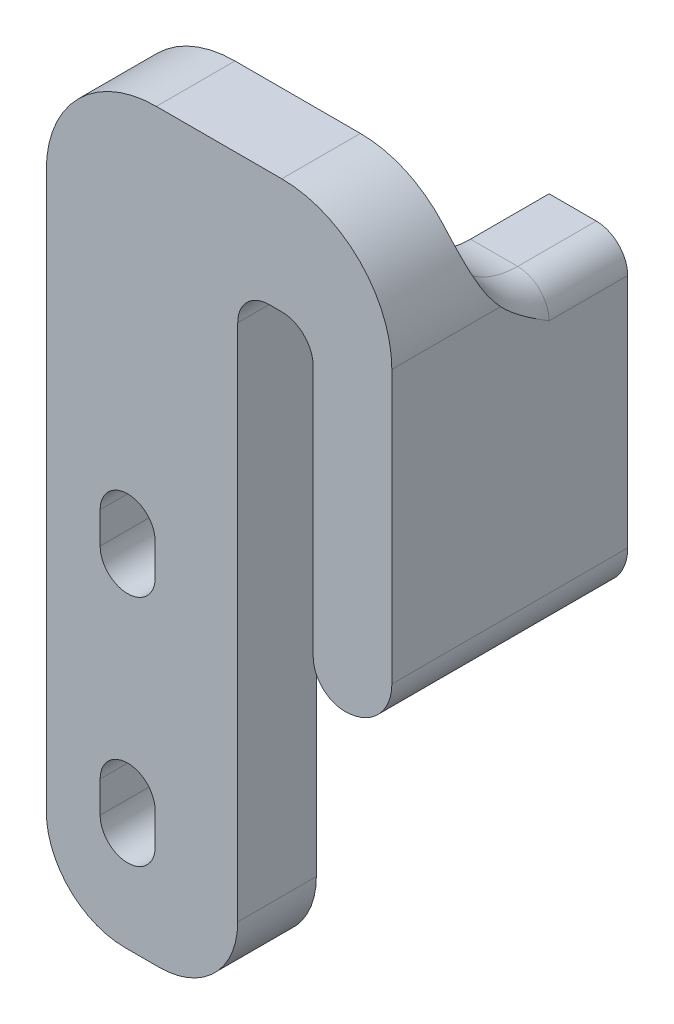
ISO-10303-21;
HEADER;
FILE_DESCRIPTION(('STEP AP214'),'2;1');
FILE_NAME('part.step','',(''),(''),'','','');
FILE_SCHEMA(('AUTOMOTIVE_DESIGN { 1 0 10303 214 1 1 1 1 }'));
ENDSEC;
DATA;
#1=APPLICATION_CONTEXT('core data for automotive mechanical design processes');
#2=APPLICATION_PROTOCOL_DEFINITION('international standard','automotive_design',2000,#1);
#3=PRODUCT_CONTEXT('',#1,'mechanical');
#4=PRODUCT('Part','Part','',(#3));
#5=PRODUCT_RELATED_PRODUCT_CATEGORY('part','',(#4));
#6=PRODUCT_DEFINITION_FORMATION('','',#4);
#7=PRODUCT_DEFINITION_CONTEXT('part definition',#1,'design');
#8=PRODUCT_DEFINITION('design','',#6,#7);
#9=PRODUCT_DEFINITION_SHAPE('','',#8);
#10=(LENGTH_UNIT() NAMED_UNIT(*) SI_UNIT(.MILLI.,.METRE.));
#11=(NAMED_UNIT(*) PLANE_ANGLE_UNIT() SI_UNIT($,.RADIAN.));
#12=(NAMED_UNIT(*) SI_UNIT($,.STERADIAN.) SOLID_ANGLE_UNIT());
#13=UNCERTAINTY_MEASURE_WITH_UNIT(LENGTH_MEASURE(1.E-05),#10,'distance_accuracy_value','');
#14=(GEOMETRIC_REPRESENTATION_CONTEXT(3) GLOBAL_UNCERTAINTY_ASSIGNED_CONTEXT((#13)) GLOBAL_UNIT_ASSIGNED_CONTEXT((#10,
#11,#12)) REPRESENTATION_CONTEXT('',''));
#15=CARTESIAN_POINT('',(0.,0.,0.));
#16=DIRECTION('',(0.,0.,1.));
#17=DIRECTION('',(1.,0.,0.));
#18=AXIS2_PLACEMENT_3D('',#15,#16,#17);
#19=CARTESIAN_POINT('',(0.,0.,0.));
#20=DIRECTION('',(0.,0.,-1.));
#21=DIRECTION('',(-1.,0.,0.));
#22=AXIS2_PLACEMENT_3D('',#19,#20,#21);
#23=PLANE('',#22);
#24=DIRECTION('',(0.,-1.,0.));
#25=VECTOR('',#24,1.);
#26=CARTESIAN_POINT('',(-3.66240887052868,1.5,0.));
#27=LINE('',#26,#25);
#28=CARTESIAN_POINT('',(-3.66240887052868,3.5,0.));
#29=VERTEX_POINT('',#28);
#30=CARTESIAN_POINT('',(-3.66240887052868,1.5,0.));
#31=VERTEX_POINT('',#30);
#32=EDGE_CURVE('E274',#29,#31,#27,.T.);
#33=ORIENTED_EDGE('',*,*,#32,.T.);
#34=CARTESIAN_POINT('',(-1.91240887052868,1.5,0.));
#35=DIRECTION('',(0.,0.,1.));
#36=DIRECTION('',(1.,0.,0.));
#37=AXIS2_PLACEMENT_3D('',#34,#35,#36);
#38=CIRCLE('',#37,1.75);
#39=CARTESIAN_POINT('',(-0.162408870528676,1.5,0.));
#40=VERTEX_POINT('',#39);
#41=EDGE_CURVE('E270',#31,#40,#38,.T.);
#42=ORIENTED_EDGE('',*,*,#41,.T.);
#43=DIRECTION('',(0.,1.,0.));
#44=VECTOR('',#43,1.);
#45=CARTESIAN_POINT('',(-0.162408870528676,1.5,0.));
#46=LINE('',#45,#44);
#47=CARTESIAN_POINT('',(-0.162408870528676,3.5,0.));
#48=VERTEX_POINT('',#47);
#49=EDGE_CURVE('E284',#40,#48,#46,.T.);
#50=ORIENTED_EDGE('',*,*,#49,.T.);
#51=CARTESIAN_POINT('',(-1.91240887052868,3.5,0.));
#52=DIRECTION('',(0.,0.,1.));
#53=DIRECTION('',(1.,0.,0.));
#54=AXIS2_PLACEMENT_3D('',#51,#52,#53);
#55=CIRCLE('',#54,1.75);
#56=EDGE_CURVE('E287',#48,#29,#55,.T.);
#57=ORIENTED_EDGE('',*,*,#56,.T.);
#58=EDGE_LOOP('',(#33,#42,#50,#57));
#59=FACE_BOUND('',#58,.T.);
#60=DIRECTION('',(0.,-1.,0.));
#61=VECTOR('',#60,1.);
#62=CARTESIAN_POINT('',(-3.66240887052868,-13.3256409288402,0.));
#63=LINE('',#62,#61);
#64=CARTESIAN_POINT('',(-3.66240887052868,-11.3256409288402,0.));
#65=VERTEX_POINT('',#64);
#66=CARTESIAN_POINT('',(-3.66240887052868,-13.3256409288402,0.));
#67=VERTEX_POINT('',#66);
#68=EDGE_CURVE('E243',#65,#67,#63,.T.);
#69=ORIENTED_EDGE('',*,*,#68,.T.);
#70=CARTESIAN_POINT('',(-1.91240887052868,-13.3256409288402,0.));
#71=DIRECTION('',(0.,0.,1.));
#72=DIRECTION('',(1.,0.,0.));
#73=AXIS2_PLACEMENT_3D('',#70,#71,#72);
#74=CIRCLE('',#73,1.75);
#75=CARTESIAN_POINT('',(-0.162408870528676,-13.3256409288402,0.));
#76=VERTEX_POINT('',#75);
#77=EDGE_CURVE('E232',#67,#76,#74,.T.);
#78=ORIENTED_EDGE('',*,*,#77,.T.);
#79=DIRECTION('',(0.,1.,0.));
#80=VECTOR('',#79,1.);
#81=CARTESIAN_POINT('',(-0.162408870528676,-13.3256409288402,0.));
#82=LINE('',#81,#80);
#83=CARTESIAN_POINT('',(-0.162408870528677,-11.3256409288402,0.));
#84=VERTEX_POINT('',#83);
#85=EDGE_CURVE('E253',#76,#84,#82,.T.);
#86=ORIENTED_EDGE('',*,*,#85,.T.);
#87=CARTESIAN_POINT('',(-1.91240887052868,-11.3256409288402,0.));
#88=DIRECTION('',(0.,0.,1.));
#89=DIRECTION('',(1.,0.,0.));
#90=AXIS2_PLACEMENT_3D('',#87,#88,#89);
#91=CIRCLE('',#90,1.75);
#92=EDGE_CURVE('E256',#84,#65,#91,.T.);
#93=ORIENTED_EDGE('',*,*,#92,.T.);
#94=EDGE_LOOP('',(#69,#78,#86,#93));
#95=FACE_BOUND('',#94,.T.);
#96=CARTESIAN_POINT('',(7.88759112947134,20.5,0.));
#97=DIRECTION('',(0.,0.,-1.));
#98=DIRECTION('',(-1.,0.,0.));
#99=AXIS2_PLACEMENT_3D('',#96,#97,#98);
#100=CIRCLE('',#99,7.);
#101=CARTESIAN_POINT('',(7.88759112947134,27.5,0.));
#102=VERTEX_POINT('',#101);
#103=CARTESIAN_POINT('',(13.1011127977164,25.1711017773903,0.));
#104=VERTEX_POINT('',#103);
#105=EDGE_CURVE('E344',#102,#104,#100,.T.);
#106=ORIENTED_EDGE('',*,*,#105,.T.);
#107=CARTESIAN_POINT('',(12.8875911294713,18.1743590711598,0.));
#108=DIRECTION('',(0.,0.,-1.));
#109=DIRECTION('',(-1.,0.,0.));
#110=AXIS2_PLACEMENT_3D('',#107,#108,#109);
#111=CIRCLE('',#110,7.);
#112=CARTESIAN_POINT('',(12.8875911294713,25.1743590711598,0.));
#113=VERTEX_POINT('',#112);
#114=EDGE_CURVE('E417',#104,#113,#111,.F.);
#115=ORIENTED_EDGE('',*,*,#114,.T.);
#116=DIRECTION('',(-1.,0.,0.));
#117=VECTOR('',#116,1.);
#118=CARTESIAN_POINT('',(9.88759112947133,25.1743590711598,0.));
#119=LINE('',#118,#117);
#120=CARTESIAN_POINT('',(9.88759112947133,25.1743590711598,0.));
#121=VERTEX_POINT('',#120);
#122=EDGE_CURVE('E411',#113,#121,#119,.T.);
#123=ORIENTED_EDGE('',*,*,#122,.T.);
#124=DIRECTION('',(0.,1.,0.));
#125=VECTOR('',#124,1.);
#126=CARTESIAN_POINT('',(9.88759112947134,0.174359071159812,0.));
#127=LINE('',#126,#125);
#128=CARTESIAN_POINT('',(9.88759112947133,18.1743590711598,0.));
#129=VERTEX_POINT('',#128);
#130=EDGE_CURVE('E386',#129,#121,#127,.T.);
#131=ORIENTED_EDGE('',*,*,#130,.F.);
#132=CARTESIAN_POINT('',(7.88759112947133,18.1743590711598,0.));
#133=DIRECTION('',(0.,0.,-1.));
#134=DIRECTION('',(-1.,0.,0.));
#135=AXIS2_PLACEMENT_3D('',#132,#133,#134);
#136=CIRCLE('',#135,2.);
#137=CARTESIAN_POINT('',(7.88759112947133,20.1743590711598,0.));
#138=VERTEX_POINT('',#137);
#139=EDGE_CURVE('E403',#129,#138,#136,.F.);
#140=ORIENTED_EDGE('',*,*,#139,.T.);
#141=DIRECTION('',(1.,0.,0.));
#142=VECTOR('',#141,1.);
#143=CARTESIAN_POINT('',(9.88759112947133,20.1743590711598,0.));
#144=LINE('',#143,#142);
#145=CARTESIAN_POINT('',(7.08759112947132,20.1743590711598,0.));
#146=VERTEX_POINT('',#145);
#147=EDGE_CURVE('E333',#146,#138,#144,.T.);
#148=ORIENTED_EDGE('',*,*,#147,.F.);
#149=CARTESIAN_POINT('',(7.08759112947132,18.1743590711598,0.));
#150=DIRECTION('',(0.,0.,-1.));
#151=DIRECTION('',(-1.,0.,0.));
#152=AXIS2_PLACEMENT_3D('',#149,#150,#151);
#153=CIRCLE('',#152,2.);
#154=CARTESIAN_POINT('',(5.08759112947132,18.1743590711598,0.));
#155=VERTEX_POINT('',#154);
#156=EDGE_CURVE('E407',#146,#155,#153,.F.);
#157=ORIENTED_EDGE('',*,*,#156,.T.);
#158=DIRECTION('',(0.,1.,0.));
#159=VECTOR('',#158,1.);
#160=CARTESIAN_POINT('',(5.08759112947132,-19.8256409288402,0.));
#161=LINE('',#160,#159);
#162=CARTESIAN_POINT('',(5.08759112947132,-14.8256409288402,0.));
#163=VERTEX_POINT('',#162);
#164=EDGE_CURVE('E330',#163,#155,#161,.T.);
#165=ORIENTED_EDGE('',*,*,#164,.F.);
#166=CARTESIAN_POINT('',(0.0875911294713214,-14.8256409288402,0.));
#167=DIRECTION('',(0.,0.,-1.));
#168=DIRECTION('',(-1.,0.,0.));
#169=AXIS2_PLACEMENT_3D('',#166,#167,#168);
#170=CIRCLE('',#169,5.);
#171=CARTESIAN_POINT('',(0.0875911294713197,-19.8256409288402,0.));
#172=VERTEX_POINT('',#171);
#173=EDGE_CURVE('E347',#163,#172,#170,.T.);
#174=ORIENTED_EDGE('',*,*,#173,.T.);
#175=DIRECTION('',(1.,0.,0.));
#176=VECTOR('',#175,1.);
#177=CARTESIAN_POINT('',(-7.08759112947132,-19.8256409288402,0.));
#178=LINE('',#177,#176);
#179=CARTESIAN_POINT('',(-2.08759112947132,-19.8256409288402,0.));
#180=VERTEX_POINT('',#179);
#181=EDGE_CURVE('E327',#180,#172,#178,.T.);
#182=ORIENTED_EDGE('',*,*,#181,.F.);
#183=CARTESIAN_POINT('',(-2.08759112947132,-14.8256409288402,0.));
#184=DIRECTION('',(0.,0.,-1.));
#185=DIRECTION('',(-1.,0.,0.));
#186=AXIS2_PLACEMENT_3D('',#183,#184,#185);
#187=CIRCLE('',#186,5.);
#188=CARTESIAN_POINT('',(-7.08759112947132,-14.8256409288402,0.));
#189=VERTEX_POINT('',#188);
#190=EDGE_CURVE('E349',#180,#189,#187,.T.);
#191=ORIENTED_EDGE('',*,*,#190,.T.);
#192=DIRECTION('',(0.,-1.,0.));
#193=VECTOR('',#192,1.);
#194=CARTESIAN_POINT('',(-7.08759112947132,-19.8256409288402,0.));
#195=LINE('',#194,#193);
#196=CARTESIAN_POINT('',(-7.08759112947132,20.5,0.));
#197=VERTEX_POINT('',#196);
#198=EDGE_CURVE('E301',#197,#189,#195,.T.);
#199=ORIENTED_EDGE('',*,*,#198,.F.);
#200=CARTESIAN_POINT('',(-0.0875911294713205,20.5,0.));
#201=DIRECTION('',(0.,0.,-1.));
#202=DIRECTION('',(-1.,0.,0.));
#203=AXIS2_PLACEMENT_3D('',#200,#201,#202);
#204=CIRCLE('',#203,7.);
#205=CARTESIAN_POINT('',(-0.0875911294713205,27.5,0.));
#206=VERTEX_POINT('',#205);
#207=EDGE_CURVE('E342',#197,#206,#204,.T.);
#208=ORIENTED_EDGE('',*,*,#207,.T.);
#209=DIRECTION('',(-1.,0.,0.));
#210=VECTOR('',#209,1.);
#211=CARTESIAN_POINT('',(4.91240887052868,27.5,0.));
#212=LINE('',#211,#210);
#213=EDGE_CURVE('E306',#102,#206,#212,.T.);
#214=ORIENTED_EDGE('',*,*,#213,.F.);
#215=EDGE_LOOP('',(#106,#115,#123,#131,#140,#148,#157,#165,#174,#182,#191,#199,#208,#214));
#216=FACE_BOUND('',#215,.T.);
#217=ADVANCED_FACE('F36',(#59,#95,#216),#23,.T.);
#218=CARTESIAN_POINT('',(0.,0.,5.));
#219=DIRECTION('',(0.,0.,-1.));
#220=DIRECTION('',(-1.,0.,0.));
#221=AXIS2_PLACEMENT_3D('',#218,#219,#220);
#222=PLANE('',#221);
#223=CARTESIAN_POINT('',(-1.91240887052868,1.5,5.));
#224=DIRECTION('',(0.,0.,1.));
#225=DIRECTION('',(1.,0.,0.));
#226=AXIS2_PLACEMENT_3D('',#223,#224,#225);
#227=CIRCLE('',#226,1.75);
#228=CARTESIAN_POINT('',(-3.66240887052868,1.5,5.));
#229=VERTEX_POINT('',#228);
#230=CARTESIAN_POINT('',(-0.162408870528676,1.5,5.));
#231=VERTEX_POINT('',#230);
#232=EDGE_CURVE('E271',#229,#231,#227,.T.);
#233=ORIENTED_EDGE('',*,*,#232,.F.);
#234=DIRECTION('',(0.,-1.,0.));
#235=VECTOR('',#234,1.);
#236=CARTESIAN_POINT('',(-3.66240887052868,1.5,5.));
#237=LINE('',#236,#235);
#238=CARTESIAN_POINT('',(-3.66240887052868,3.5,5.));
#239=VERTEX_POINT('',#238);
#240=EDGE_CURVE('E279',#239,#229,#237,.T.);
#241=ORIENTED_EDGE('',*,*,#240,.F.);
#242=CARTESIAN_POINT('',(-1.91240887052868,3.5,5.));
#243=DIRECTION('',(0.,0.,1.));
#244=DIRECTION('',(1.,0.,0.));
#245=AXIS2_PLACEMENT_3D('',#242,#243,#244);
#246=CIRCLE('',#245,1.75);
#247=CARTESIAN_POINT('',(-0.162408870528676,3.5,5.));
#248=VERTEX_POINT('',#247);
#249=EDGE_CURVE('E276',#248,#239,#246,.T.);
#250=ORIENTED_EDGE('',*,*,#249,.F.);
#251=DIRECTION('',(0.,1.,0.));
#252=VECTOR('',#251,1.);
#253=CARTESIAN_POINT('',(-0.162408870528676,1.5,5.));
#254=LINE('',#253,#252);
#255=EDGE_CURVE('E273',#231,#248,#254,.T.);
#256=ORIENTED_EDGE('',*,*,#255,.F.);
#257=EDGE_LOOP('',(#233,#241,#250,#256));
#258=FACE_BOUND('',#257,.T.);
#259=DIRECTION('',(0.,-1.,0.));
#260=VECTOR('',#259,1.);
#261=CARTESIAN_POINT('',(-7.08759112947132,-19.8256409288402,5.));
#262=LINE('',#261,#260);
#263=CARTESIAN_POINT('',(-7.08759112947132,20.5,5.));
#264=VERTEX_POINT('',#263);
#265=CARTESIAN_POINT('',(-7.08759112947132,-14.8256409288402,5.));
#266=VERTEX_POINT('',#265);
#267=EDGE_CURVE('E305',#264,#266,#262,.T.);
#268=ORIENTED_EDGE('',*,*,#267,.T.);
#269=CARTESIAN_POINT('',(-2.08759112947132,-14.8256409288402,5.));
#270=DIRECTION('',(0.,0.,-1.));
#271=DIRECTION('',(-1.,0.,0.));
#272=AXIS2_PLACEMENT_3D('',#269,#270,#271);
#273=CIRCLE('',#272,5.);
#274=CARTESIAN_POINT('',(-2.08759112947132,-19.8256409288402,5.));
#275=VERTEX_POINT('',#274);
#276=EDGE_CURVE('E366',#266,#275,#273,.F.);
#277=ORIENTED_EDGE('',*,*,#276,.T.);
#278=DIRECTION('',(1.,0.,0.));
#279=VECTOR('',#278,1.);
#280=CARTESIAN_POINT('',(-7.08759112947132,-19.8256409288402,5.));
#281=LINE('',#280,#279);
#282=CARTESIAN_POINT('',(0.0875911294713197,-19.8256409288402,5.));
#283=VERTEX_POINT('',#282);
#284=EDGE_CURVE('E309',#275,#283,#281,.T.);
#285=ORIENTED_EDGE('',*,*,#284,.T.);
#286=CARTESIAN_POINT('',(0.0875911294713214,-14.8256409288402,5.));
#287=DIRECTION('',(0.,0.,-1.));
#288=DIRECTION('',(-1.,0.,0.));
#289=AXIS2_PLACEMENT_3D('',#286,#287,#288);
#290=CIRCLE('',#289,5.);
#291=CARTESIAN_POINT('',(5.08759112947132,-14.8256409288402,5.));
#292=VERTEX_POINT('',#291);
#293=EDGE_CURVE('E364',#283,#292,#290,.F.);
#294=ORIENTED_EDGE('',*,*,#293,.T.);
#295=DIRECTION('',(0.,1.,0.));
#296=VECTOR('',#295,1.);
#297=CARTESIAN_POINT('',(5.08759112947132,-19.8256409288402,5.));
#298=LINE('',#297,#296);
#299=CARTESIAN_POINT('',(5.08759112947132,18.1743590711598,5.));
#300=VERTEX_POINT('',#299);
#301=EDGE_CURVE('E312',#292,#300,#298,.T.);
#302=ORIENTED_EDGE('',*,*,#301,.T.);
#303=CARTESIAN_POINT('',(7.08759112947132,18.1743590711598,5.));
#304=DIRECTION('',(0.,0.,-1.));
#305=DIRECTION('',(-1.,0.,0.));
#306=AXIS2_PLACEMENT_3D('',#303,#304,#305);
#307=CIRCLE('',#306,2.);
#308=CARTESIAN_POINT('',(7.08759112947132,20.1743590711598,5.));
#309=VERTEX_POINT('',#308);
#310=EDGE_CURVE('E409',#300,#309,#307,.T.);
#311=ORIENTED_EDGE('',*,*,#310,.T.);
#312=DIRECTION('',(1.,0.,0.));
#313=VECTOR('',#312,1.);
#314=CARTESIAN_POINT('',(9.88759112947133,20.1743590711598,5.));
#315=LINE('',#314,#313);
#316=CARTESIAN_POINT('',(7.88759112947133,20.1743590711598,5.));
#317=VERTEX_POINT('',#316);
#318=EDGE_CURVE('E315',#309,#317,#315,.T.);
#319=ORIENTED_EDGE('',*,*,#318,.T.);
#320=CARTESIAN_POINT('',(7.88759112947133,18.1743590711598,5.));
#321=DIRECTION('',(0.,0.,-1.));
#322=DIRECTION('',(-1.,0.,0.));
#323=AXIS2_PLACEMENT_3D('',#320,#321,#322);
#324=CIRCLE('',#323,2.);
#325=CARTESIAN_POINT('',(9.88759112947133,18.1743590711598,5.));
#326=VERTEX_POINT('',#325);
#327=EDGE_CURVE('E405',#317,#326,#324,.T.);
#328=ORIENTED_EDGE('',*,*,#327,.T.);
#329=DIRECTION('',(0.,-1.,0.));
#330=VECTOR('',#329,1.);
#331=CARTESIAN_POINT('',(9.88759112947134,0.174359071159812,5.));
#332=LINE('',#331,#330);
#333=CARTESIAN_POINT('',(9.88759112947134,2.17435907115981,5.));
#334=VERTEX_POINT('',#333);
#335=EDGE_CURVE('E318',#326,#334,#332,.T.);
#336=ORIENTED_EDGE('',*,*,#335,.T.);
#337=CARTESIAN_POINT('',(11.8875911294713,2.17435907115981,5.));
#338=DIRECTION('',(0.,0.,-1.));
#339=DIRECTION('',(-1.,0.,0.));
#340=AXIS2_PLACEMENT_3D('',#337,#338,#339);
#341=CIRCLE('',#340,2.);
#342=CARTESIAN_POINT('',(11.8875911294713,0.174359071159813,5.));
#343=VERTEX_POINT('',#342);
#344=EDGE_CURVE('E360',#334,#343,#341,.F.);
#345=ORIENTED_EDGE('',*,*,#344,.T.);
#346=CARTESIAN_POINT('',(11.8875911294713,3.17435907115981,5.));
#347=DIRECTION('',(0.,0.,-1.));
#348=DIRECTION('',(-1.,0.,0.));
#349=AXIS2_PLACEMENT_3D('',#346,#347,#348);
#350=CIRCLE('',#349,3.);
#351=CARTESIAN_POINT('',(14.8875911294713,3.17435907115981,5.));
#352=VERTEX_POINT('',#351);
#353=EDGE_CURVE('E362',#343,#352,#350,.F.);
#354=ORIENTED_EDGE('',*,*,#353,.T.);
#355=DIRECTION('',(0.,1.,0.));
#356=VECTOR('',#355,1.);
#357=CARTESIAN_POINT('',(14.8875911294713,27.5,5.));
#358=LINE('',#357,#356);
#359=CARTESIAN_POINT('',(14.8875911294713,20.5,5.));
#360=VERTEX_POINT('',#359);
#361=EDGE_CURVE('E321',#352,#360,#358,.T.);
#362=ORIENTED_EDGE('',*,*,#361,.T.);
#363=CARTESIAN_POINT('',(7.88759112947134,20.5,5.));
#364=DIRECTION('',(0.,0.,-1.));
#365=DIRECTION('',(-1.,0.,0.));
#366=AXIS2_PLACEMENT_3D('',#363,#364,#365);
#367=CIRCLE('',#366,7.);
#368=CARTESIAN_POINT('',(7.88759112947134,27.5,5.));
#369=VERTEX_POINT('',#368);
#370=EDGE_CURVE('E358',#360,#369,#367,.F.);
#371=ORIENTED_EDGE('',*,*,#370,.T.);
#372=DIRECTION('',(-1.,0.,0.));
#373=VECTOR('',#372,1.);
#374=CARTESIAN_POINT('',(-7.08759112947132,27.5,5.));
#375=LINE('',#374,#373);
#376=CARTESIAN_POINT('',(-0.0875911294713205,27.5,5.));
#377=VERTEX_POINT('',#376);
#378=EDGE_CURVE('E302',#369,#377,#375,.T.);
#379=ORIENTED_EDGE('',*,*,#378,.T.);
#380=CARTESIAN_POINT('',(-0.0875911294713205,20.5,5.));
#381=DIRECTION('',(0.,0.,-1.));
#382=DIRECTION('',(-1.,0.,0.));
#383=AXIS2_PLACEMENT_3D('',#380,#381,#382);
#384=CIRCLE('',#383,7.);
#385=EDGE_CURVE('E356',#377,#264,#384,.F.);
#386=ORIENTED_EDGE('',*,*,#385,.T.);
#387=EDGE_LOOP('',(#268,#277,#285,#294,#302,#311,#319,#328,#336,#345,#354,#362,#371,#379,#386));
#388=FACE_BOUND('',#387,.T.);
#389=CARTESIAN_POINT('',(-1.91240887052868,-13.3256409288402,5.));
#390=DIRECTION('',(0.,0.,1.));
#391=DIRECTION('',(1.,0.,0.));
#392=AXIS2_PLACEMENT_3D('',#389,#390,#391);
#393=CIRCLE('',#392,1.75);
#394=CARTESIAN_POINT('',(-3.66240887052868,-13.3256409288402,5.));
#395=VERTEX_POINT('',#394);
#396=CARTESIAN_POINT('',(-0.162408870528676,-13.3256409288402,5.));
#397=VERTEX_POINT('',#396);
#398=EDGE_CURVE('E240',#395,#397,#393,.T.);
#399=ORIENTED_EDGE('',*,*,#398,.F.);
#400=DIRECTION('',(0.,-1.,0.));
#401=VECTOR('',#400,1.);
#402=CARTESIAN_POINT('',(-3.66240887052868,-13.3256409288402,5.));
#403=LINE('',#402,#401);
#404=CARTESIAN_POINT('',(-3.66240887052868,-11.3256409288402,5.));
#405=VERTEX_POINT('',#404);
#406=EDGE_CURVE('E248',#405,#395,#403,.T.);
#407=ORIENTED_EDGE('',*,*,#406,.F.);
#408=CARTESIAN_POINT('',(-1.91240887052868,-11.3256409288402,5.));
#409=DIRECTION('',(0.,0.,1.));
#410=DIRECTION('',(1.,0.,0.));
#411=AXIS2_PLACEMENT_3D('',#408,#409,#410);
#412=CIRCLE('',#411,1.75);
#413=CARTESIAN_POINT('',(-0.162408870528677,-11.3256409288402,5.));
#414=VERTEX_POINT('',#413);
#415=EDGE_CURVE('E245',#414,#405,#412,.T.);
#416=ORIENTED_EDGE('',*,*,#415,.F.);
#417=DIRECTION('',(0.,1.,0.));
#418=VECTOR('',#417,1.);
#419=CARTESIAN_POINT('',(-0.162408870528676,-13.3256409288402,5.));
#420=LINE('',#419,#418);
#421=EDGE_CURVE('E242',#397,#414,#420,.T.);
#422=ORIENTED_EDGE('',*,*,#421,.F.);
#423=EDGE_LOOP('',(#399,#407,#416,#422));
#424=FACE_BOUND('',#423,.T.);
#425=ADVANCED_FACE('F464',(#258,#388,#424),#222,.F.);
#426=CARTESIAN_POINT('',(-7.08759112947132,-19.8256409288402,5.));
#427=DIRECTION('',(1.,0.,0.));
#428=DIRECTION('',(0.,0.,-1.));
#429=AXIS2_PLACEMENT_3D('',#426,#427,#428);
#430=PLANE('',#429);
#431=ORIENTED_EDGE('',*,*,#198,.T.);
#432=DIRECTION('',(0.,0.,-1.));
#433=VECTOR('',#432,1.);
#434=CARTESIAN_POINT('',(-7.08759112947132,-14.8256409288402,5.));
#435=LINE('',#434,#433);
#436=EDGE_CURVE('E354',#189,#266,#435,.F.);
#437=ORIENTED_EDGE('',*,*,#436,.T.);
#438=ORIENTED_EDGE('',*,*,#267,.F.);
#439=DIRECTION('',(0.,0.,-1.));
#440=VECTOR('',#439,1.);
#441=CARTESIAN_POINT('',(-7.08759112947132,20.5,5.));
#442=LINE('',#441,#440);
#443=EDGE_CURVE('E351',#264,#197,#442,.T.);
#444=ORIENTED_EDGE('',*,*,#443,.T.);
#445=EDGE_LOOP('',(#431,#437,#438,#444));
#446=FACE_BOUND('',#445,.T.);
#447=ADVANCED_FACE('F460',(#446),#430,.F.);
#448=CARTESIAN_POINT('',(-7.08759112947132,-19.8256409288402,5.));
#449=DIRECTION('',(0.,1.,0.));
#450=DIRECTION('',(0.,0.,1.));
#451=AXIS2_PLACEMENT_3D('',#448,#449,#450);
#452=PLANE('',#451);
#453=ORIENTED_EDGE('',*,*,#284,.F.);
#454=DIRECTION('',(0.,0.,-1.));
#455=VECTOR('',#454,1.);
#456=CARTESIAN_POINT('',(-2.08759112947132,-19.8256409288402,5.));
#457=LINE('',#456,#455);
#458=EDGE_CURVE('E339',#275,#180,#457,.T.);
#459=ORIENTED_EDGE('',*,*,#458,.T.);
#460=ORIENTED_EDGE('',*,*,#181,.T.);
#461=DIRECTION('',(0.,0.,-1.));
#462=VECTOR('',#461,1.);
#463=CARTESIAN_POINT('',(0.0875911294713214,-19.8256409288402,5.));
#464=LINE('',#463,#462);
#465=EDGE_CURVE('E324',#172,#283,#464,.F.);
#466=ORIENTED_EDGE('',*,*,#465,.T.);
#467=EDGE_LOOP('',(#453,#459,#460,#466));
#468=FACE_BOUND('',#467,.T.);
#469=ADVANCED_FACE('F456',(#468),#452,.F.);
#470=CARTESIAN_POINT('',(5.08759112947132,-19.8256409288402,5.));
#471=DIRECTION('',(-1.,0.,0.));
#472=DIRECTION('',(0.,0.,1.));
#473=AXIS2_PLACEMENT_3D('',#470,#471,#472);
#474=PLANE('',#473);
#475=ORIENTED_EDGE('',*,*,#301,.F.);
#476=DIRECTION('',(0.,0.,-1.));
#477=VECTOR('',#476,1.);
#478=CARTESIAN_POINT('',(5.08759112947132,-14.8256409288402,5.));
#479=LINE('',#478,#477);
#480=EDGE_CURVE('E370',#292,#163,#479,.T.);
#481=ORIENTED_EDGE('',*,*,#480,.T.);
#482=ORIENTED_EDGE('',*,*,#164,.T.);
#483=DIRECTION('',(0.,0.,-1.));
#484=VECTOR('',#483,1.);
#485=CARTESIAN_POINT('',(5.08759112947132,18.1743590711598,5.));
#486=LINE('',#485,#484);
#487=EDGE_CURVE('E368',#155,#300,#486,.F.);
#488=ORIENTED_EDGE('',*,*,#487,.T.);
#489=EDGE_LOOP('',(#475,#481,#482,#488));
#490=FACE_BOUND('',#489,.T.);
#491=ADVANCED_FACE('F452',(#490),#474,.F.);
#492=CARTESIAN_POINT('',(9.88759112947133,20.1743590711598,5.));
#493=DIRECTION('',(0.,1.,0.));
#494=DIRECTION('',(0.,0.,1.));
#495=AXIS2_PLACEMENT_3D('',#492,#493,#494);
#496=PLANE('',#495);
#497=ORIENTED_EDGE('',*,*,#147,.T.);
#498=DIRECTION('',(0.,0.,-1.));
#499=VECTOR('',#498,1.);
#500=CARTESIAN_POINT('',(7.88759112947133,20.1743590711598,5.));
#501=LINE('',#500,#499);
#502=EDGE_CURVE('E396',#138,#317,#501,.F.);
#503=ORIENTED_EDGE('',*,*,#502,.T.);
#504=ORIENTED_EDGE('',*,*,#318,.F.);
#505=DIRECTION('',(0.,0.,-1.));
#506=VECTOR('',#505,1.);
#507=CARTESIAN_POINT('',(7.08759112947132,20.1743590711598,0.));
#508=LINE('',#507,#506);
#509=EDGE_CURVE('E393',#309,#146,#508,.T.);
#510=ORIENTED_EDGE('',*,*,#509,.T.);
#511=EDGE_LOOP('',(#497,#503,#504,#510));
#512=FACE_BOUND('',#511,.T.);
#513=ADVANCED_FACE('F449',(#512),#496,.F.);
#514=CARTESIAN_POINT('',(9.88759112947134,0.174359071159812,5.));
#515=DIRECTION('',(1.,0.,0.));
#516=DIRECTION('',(0.,1.,0.));
#517=AXIS2_PLACEMENT_3D('',#514,#515,#516);
#518=PLANE('',#517);
#519=DIRECTION('',(0.,-1.,0.));
#520=VECTOR('',#519,1.);
#521=CARTESIAN_POINT('',(9.88759112947134,0.174359071159812,-10.));
#522=LINE('',#521,#520);
#523=CARTESIAN_POINT('',(9.88759112947134,20.1743590711598,-10.));
#524=VERTEX_POINT('',#523);
#525=CARTESIAN_POINT('',(9.88759112947134,2.17435907115981,-10.));
#526=VERTEX_POINT('',#525);
#527=EDGE_CURVE('E226',#524,#526,#522,.T.);
#528=ORIENTED_EDGE('',*,*,#527,.T.);
#529=DIRECTION('',(0.,0.,-1.));
#530=VECTOR('',#529,1.);
#531=CARTESIAN_POINT('',(9.88759112947134,2.17435907115981,5.));
#532=LINE('',#531,#530);
#533=EDGE_CURVE('E391',#526,#334,#532,.F.);
#534=ORIENTED_EDGE('',*,*,#533,.T.);
#535=ORIENTED_EDGE('',*,*,#335,.F.);
#536=DIRECTION('',(0.,0.,-1.));
#537=VECTOR('',#536,1.);
#538=CARTESIAN_POINT('',(9.88759112947133,18.1743590711598,0.));
#539=LINE('',#538,#537);
#540=EDGE_CURVE('E388',#326,#129,#539,.T.);
#541=ORIENTED_EDGE('',*,*,#540,.T.);
#542=ORIENTED_EDGE('',*,*,#130,.T.);
#543=CARTESIAN_POINT('',(9.88759112947133,25.1743590711598,-5.));
#544=DIRECTION('',(1.,0.,0.));
#545=DIRECTION('',(0.,1.,0.));
#546=AXIS2_PLACEMENT_3D('',#543,#544,#545);
#547=CIRCLE('',#546,5.);
#548=CARTESIAN_POINT('',(9.88759112947134,20.1743590711598,-5.));
#549=VERTEX_POINT('',#548);
#550=EDGE_CURVE('E12',#121,#549,#547,.T.);
#551=ORIENTED_EDGE('',*,*,#550,.T.);
#552=DIRECTION('',(0.,0.,1.));
#553=VECTOR('',#552,1.);
#554=CARTESIAN_POINT('',(9.88759112947134,20.1743590711598,-10.));
#555=LINE('',#554,#553);
#556=EDGE_CURVE('E219',#524,#549,#555,.T.);
#557=ORIENTED_EDGE('',*,*,#556,.F.);
#558=EDGE_LOOP('',(#528,#534,#535,#541,#542,#551,#557));
#559=FACE_BOUND('',#558,.T.);
#560=ADVANCED_FACE('F230',(#559),#518,.F.);
#561=CARTESIAN_POINT('',(14.8875911294713,27.5,5.));
#562=DIRECTION('',(-1.,0.,0.));
#563=DIRECTION('',(0.,-1.,0.));
#564=AXIS2_PLACEMENT_3D('',#561,#562,#563);
#565=PLANE('',#564);
#566=ORIENTED_EDGE('',*,*,#361,.F.);
#567=DIRECTION('',(0.,0.,-1.));
#568=VECTOR('',#567,1.);
#569=CARTESIAN_POINT('',(14.8875911294713,3.17435907115981,5.));
#570=LINE('',#569,#568);
#571=CARTESIAN_POINT('',(14.8875911294713,3.17435907115981,-10.));
#572=VERTEX_POINT('',#571);
#573=EDGE_CURVE('E377',#352,#572,#570,.T.);
#574=ORIENTED_EDGE('',*,*,#573,.T.);
#575=DIRECTION('',(0.,1.,0.));
#576=VECTOR('',#575,1.);
#577=CARTESIAN_POINT('',(14.8875911294713,0.174359071159813,-10.));
#578=LINE('',#577,#576);
#579=CARTESIAN_POINT('',(14.8875911294713,18.1743590711598,-10.));
#580=VERTEX_POINT('',#579);
#581=EDGE_CURVE('E227',#572,#580,#578,.T.);
#582=ORIENTED_EDGE('',*,*,#581,.T.);
#583=DIRECTION('',(0.,0.,1.));
#584=VECTOR('',#583,1.);
#585=CARTESIAN_POINT('',(14.8875911294713,18.1743590711598,0.));
#586=LINE('',#585,#584);
#587=CARTESIAN_POINT('',(14.8875911294713,18.1743590711598,-5.));
#588=VERTEX_POINT('',#587);
#589=EDGE_CURVE('E374',#580,#588,#586,.T.);
#590=ORIENTED_EDGE('',*,*,#589,.T.);
#591=CARTESIAN_POINT('',(14.8875911294713,20.5,-1.91224593931252));
#592=CARTESIAN_POINT('',(14.8875911294713,20.3850455440045,-2.02323071928419));
#593=CARTESIAN_POINT('',(14.8875911294713,20.2732358470189,-2.13739655358074));
#594=CARTESIAN_POINT('',(14.8875911294713,20.0555349475421,-2.3710958043607));
#595=CARTESIAN_POINT('',(14.8875911294713,19.9496395589453,-2.49062531357217));
#596=CARTESIAN_POINT('',(14.8875911294713,19.7435390593256,-2.73385759699929));
#597=CARTESIAN_POINT('',(14.8875911294713,19.6433179897363,-2.85754692946246));
#598=CARTESIAN_POINT('',(14.8875911294713,19.4475782642176,-3.10860665570327));
#599=CARTESIAN_POINT('',(14.8875911294713,19.3520602973712,-3.23597758458298));
#600=CARTESIAN_POINT('',(14.8875911294713,19.1632014401873,-3.49604742184478));
#601=CARTESIAN_POINT('',(14.8875911294713,19.0699370995314,-3.62880163804053));
#602=CARTESIAN_POINT('',(14.8875911294713,18.8865868464626,-3.89652771322618));
#603=CARTESIAN_POINT('',(14.8875911294713,18.7965017818985,-4.03150014991394));
#604=CARTESIAN_POINT('',(14.8875911294713,18.5293445900816,-4.43888455718717));
#605=CARTESIAN_POINT('',(14.8875911294713,18.3555881495776,-4.7134540420483));
#606=CARTESIAN_POINT('',(14.8875911294713,18.1793985926309,-4.99203181277108));
#607=CARTESIAN_POINT('',(14.8875911294713,18.1768788293872,-4.99601590819163));
#608=CARTESIAN_POINT('',(14.8875911294713,18.1743590711598,-5.));
#609=B_SPLINE_CURVE_WITH_KNOTS('',3,(#591,#592,#593,#594,#595,#596,#597,#598,#599,#600,#601,
#602,#603,#604,#605,#606,#607,#608),.UNSPECIFIED.,.F.,.F.,(4,2,2,2,2,2,2,2,4),(0.,
0.479224577054524,0.958105547998212,1.43556494879575,1.91309409844646,2.39975401952368,
2.88654275707516,3.86125486216102,3.87539699778476),.UNSPECIFIED.);
#610=CARTESIAN_POINT('',(14.8875911294713,20.5,-1.91224593931252));
#611=VERTEX_POINT('',#610);
#612=EDGE_CURVE('E424',#588,#611,#609,.F.);
#613=ORIENTED_EDGE('',*,*,#612,.T.);
#614=DIRECTION('',(0.,0.,-1.));
#615=VECTOR('',#614,1.);
#616=CARTESIAN_POINT('',(14.8875911294713,20.5,5.));
#617=LINE('',#616,#615);
#618=EDGE_CURVE('E52',#611,#360,#617,.F.);
#619=ORIENTED_EDGE('',*,*,#618,.T.);
#620=EDGE_LOOP('',(#566,#574,#582,#590,#613,#619));
#621=FACE_BOUND('',#620,.T.);
#622=ADVANCED_FACE('F439',(#621),#565,.F.);
#623=CARTESIAN_POINT('',(4.91240887052868,27.5,5.));
#624=DIRECTION('',(0.,-1.,0.));
#625=DIRECTION('',(0.,0.,-1.));
#626=AXIS2_PLACEMENT_3D('',#623,#624,#625);
#627=PLANE('',#626);
#628=ORIENTED_EDGE('',*,*,#378,.F.);
#629=DIRECTION('',(0.,0.,-1.));
#630=VECTOR('',#629,1.);
#631=CARTESIAN_POINT('',(7.88759112947134,27.5,5.));
#632=LINE('',#631,#630);
#633=EDGE_CURVE('E400',#369,#102,#632,.T.);
#634=ORIENTED_EDGE('',*,*,#633,.T.);
#635=ORIENTED_EDGE('',*,*,#213,.T.);
#636=DIRECTION('',(0.,0.,-1.));
#637=VECTOR('',#636,1.);
#638=CARTESIAN_POINT('',(-0.0875911294713205,27.5,5.));
#639=LINE('',#638,#637);
#640=EDGE_CURVE('E398',#206,#377,#639,.F.);
#641=ORIENTED_EDGE('',*,*,#640,.T.);
#642=EDGE_LOOP('',(#628,#634,#635,#641));
#643=FACE_BOUND('',#642,.T.);
#644=ADVANCED_FACE('F444',(#643),#627,.F.);
#645=CARTESIAN_POINT('',(-1.91240887052868,1.5,5.));
#646=DIRECTION('',(0.,0.,-1.));
#647=DIRECTION('',(-1.,0.,0.));
#648=AXIS2_PLACEMENT_3D('',#645,#646,#647);
#649=CYLINDRICAL_SURFACE('',#648,1.75);
#650=ORIENTED_EDGE('',*,*,#41,.F.);
#651=DIRECTION('',(0.,0.,-1.));
#652=VECTOR('',#651,1.);
#653=CARTESIAN_POINT('',(-3.66240887052868,1.5,5.));
#654=LINE('',#653,#652);
#655=EDGE_CURVE('E281',#229,#31,#654,.T.);
#656=ORIENTED_EDGE('',*,*,#655,.F.);
#657=ORIENTED_EDGE('',*,*,#232,.T.);
#658=DIRECTION('',(0.,0.,-1.));
#659=VECTOR('',#658,1.);
#660=CARTESIAN_POINT('',(-0.162408870528676,1.5,5.));
#661=LINE('',#660,#659);
#662=EDGE_CURVE('E298',#231,#40,#661,.T.);
#663=ORIENTED_EDGE('',*,*,#662,.T.);
#664=EDGE_LOOP('',(#650,#656,#657,#663));
#665=FACE_BOUND('',#664,.T.);
#666=ADVANCED_FACE('F513',(#665),#649,.F.);
#667=CARTESIAN_POINT('',(-0.162408870528676,1.5,5.));
#668=DIRECTION('',(-1.,0.,0.));
#669=DIRECTION('',(0.,-1.,0.));
#670=AXIS2_PLACEMENT_3D('',#667,#668,#669);
#671=PLANE('',#670);
#672=ORIENTED_EDGE('',*,*,#49,.F.);
#673=ORIENTED_EDGE('',*,*,#662,.F.);
#674=ORIENTED_EDGE('',*,*,#255,.T.);
#675=DIRECTION('',(0.,0.,-1.));
#676=VECTOR('',#675,1.);
#677=CARTESIAN_POINT('',(-0.162408870528676,3.5,5.));
#678=LINE('',#677,#676);
#679=EDGE_CURVE('E296',#248,#48,#678,.T.);
#680=ORIENTED_EDGE('',*,*,#679,.T.);
#681=EDGE_LOOP('',(#672,#673,#674,#680));
#682=FACE_BOUND('',#681,.T.);
#683=ADVANCED_FACE('F516',(#682),#671,.T.);
#684=CARTESIAN_POINT('',(-1.91240887052868,3.5,5.));
#685=DIRECTION('',(0.,0.,-1.));
#686=DIRECTION('',(-1.,0.,0.));
#687=AXIS2_PLACEMENT_3D('',#684,#685,#686);
#688=CYLINDRICAL_SURFACE('',#687,1.75);
#689=ORIENTED_EDGE('',*,*,#56,.F.);
#690=ORIENTED_EDGE('',*,*,#679,.F.);
#691=ORIENTED_EDGE('',*,*,#249,.T.);
#692=DIRECTION('',(0.,0.,-1.));
#693=VECTOR('',#692,1.);
#694=CARTESIAN_POINT('',(-3.66240887052868,3.5,5.));
#695=LINE('',#694,#693);
#696=EDGE_CURVE('E294',#239,#29,#695,.T.);
#697=ORIENTED_EDGE('',*,*,#696,.T.);
#698=EDGE_LOOP('',(#689,#690,#691,#697));
#699=FACE_BOUND('',#698,.T.);
#700=ADVANCED_FACE('F520',(#699),#688,.F.);
#701=CARTESIAN_POINT('',(-3.66240887052868,1.5,5.));
#702=DIRECTION('',(1.,0.,0.));
#703=DIRECTION('',(0.,1.,0.));
#704=AXIS2_PLACEMENT_3D('',#701,#702,#703);
#705=PLANE('',#704);
#706=ORIENTED_EDGE('',*,*,#32,.F.);
#707=ORIENTED_EDGE('',*,*,#696,.F.);
#708=ORIENTED_EDGE('',*,*,#240,.T.);
#709=ORIENTED_EDGE('',*,*,#655,.T.);
#710=EDGE_LOOP('',(#706,#707,#708,#709));
#711=FACE_BOUND('',#710,.T.);
#712=ADVANCED_FACE('F524',(#711),#705,.T.);
#713=CARTESIAN_POINT('',(-1.91240887052868,-13.3256409288402,5.));
#714=DIRECTION('',(0.,0.,-1.));
#715=DIRECTION('',(-1.,0.,0.));
#716=AXIS2_PLACEMENT_3D('',#713,#714,#715);
#717=CYLINDRICAL_SURFACE('',#716,1.75);
#718=ORIENTED_EDGE('',*,*,#77,.F.);
#719=DIRECTION('',(0.,0.,-1.));
#720=VECTOR('',#719,1.);
#721=CARTESIAN_POINT('',(-3.66240887052868,-13.3256409288402,5.));
#722=LINE('',#721,#720);
#723=EDGE_CURVE('E250',#395,#67,#722,.T.);
#724=ORIENTED_EDGE('',*,*,#723,.F.);
#725=ORIENTED_EDGE('',*,*,#398,.T.);
#726=DIRECTION('',(0.,0.,-1.));
#727=VECTOR('',#726,1.);
#728=CARTESIAN_POINT('',(-0.162408870528676,-13.3256409288402,5.));
#729=LINE('',#728,#727);
#730=EDGE_CURVE('E267',#397,#76,#729,.T.);
#731=ORIENTED_EDGE('',*,*,#730,.T.);
#732=EDGE_LOOP('',(#718,#724,#725,#731));
#733=FACE_BOUND('',#732,.T.);
#734=ADVANCED_FACE('F528',(#733),#717,.F.);
#735=CARTESIAN_POINT('',(-0.162408870528676,-13.3256409288402,5.));
#736=DIRECTION('',(-1.,0.,0.));
#737=DIRECTION('',(0.,-1.,0.));
#738=AXIS2_PLACEMENT_3D('',#735,#736,#737);
#739=PLANE('',#738);
#740=ORIENTED_EDGE('',*,*,#85,.F.);
#741=ORIENTED_EDGE('',*,*,#730,.F.);
#742=ORIENTED_EDGE('',*,*,#421,.T.);
#743=DIRECTION('',(0.,0.,-1.));
#744=VECTOR('',#743,1.);
#745=CARTESIAN_POINT('',(-0.162408870528677,-11.3256409288402,5.));
#746=LINE('',#745,#744);
#747=EDGE_CURVE('E265',#414,#84,#746,.T.);
#748=ORIENTED_EDGE('',*,*,#747,.T.);
#749=EDGE_LOOP('',(#740,#741,#742,#748));
#750=FACE_BOUND('',#749,.T.);
#751=ADVANCED_FACE('F532',(#750),#739,.T.);
#752=CARTESIAN_POINT('',(-1.91240887052868,-11.3256409288402,5.));
#753=DIRECTION('',(0.,0.,-1.));
#754=DIRECTION('',(-1.,0.,0.));
#755=AXIS2_PLACEMENT_3D('',#752,#753,#754);
#756=CYLINDRICAL_SURFACE('',#755,1.75);
#757=ORIENTED_EDGE('',*,*,#92,.F.);
#758=ORIENTED_EDGE('',*,*,#747,.F.);
#759=ORIENTED_EDGE('',*,*,#415,.T.);
#760=DIRECTION('',(0.,0.,-1.));
#761=VECTOR('',#760,1.);
#762=CARTESIAN_POINT('',(-3.66240887052868,-11.3256409288402,5.));
#763=LINE('',#762,#761);
#764=EDGE_CURVE('E263',#405,#65,#763,.T.);
#765=ORIENTED_EDGE('',*,*,#764,.T.);
#766=EDGE_LOOP('',(#757,#758,#759,#765));
#767=FACE_BOUND('',#766,.T.);
#768=ADVANCED_FACE('F536',(#767),#756,.F.);
#769=CARTESIAN_POINT('',(-3.66240887052868,-13.3256409288402,5.));
#770=DIRECTION('',(1.,0.,0.));
#771=DIRECTION('',(0.,1.,0.));
#772=AXIS2_PLACEMENT_3D('',#769,#770,#771);
#773=PLANE('',#772);
#774=ORIENTED_EDGE('',*,*,#68,.F.);
#775=ORIENTED_EDGE('',*,*,#764,.F.);
#776=ORIENTED_EDGE('',*,*,#406,.T.);
#777=ORIENTED_EDGE('',*,*,#723,.T.);
#778=EDGE_LOOP('',(#774,#775,#776,#777));
#779=FACE_BOUND('',#778,.T.);
#780=ADVANCED_FACE('F540',(#779),#773,.T.);
#781=CARTESIAN_POINT('',(14.8875911294713,20.1743590711598,-10.));
#782=DIRECTION('',(0.,1.,0.));
#783=DIRECTION('',(0.,0.,1.));
#784=AXIS2_PLACEMENT_3D('',#781,#782,#783);
#785=PLANE('',#784);
#786=ORIENTED_EDGE('',*,*,#556,.T.);
#787=DIRECTION('',(-1.,0.,0.));
#788=VECTOR('',#787,1.);
#789=CARTESIAN_POINT('',(12.8875911294713,20.1743590711598,-5.));
#790=LINE('',#789,#788);
#791=CARTESIAN_POINT('',(12.8875911294713,20.1743590711598,-5.));
#792=VERTEX_POINT('',#791);
#793=EDGE_CURVE('E422',#549,#792,#790,.F.);
#794=ORIENTED_EDGE('',*,*,#793,.T.);
#795=DIRECTION('',(0.,0.,1.));
#796=VECTOR('',#795,1.);
#797=CARTESIAN_POINT('',(12.8875911294713,20.1743590711598,-10.));
#798=LINE('',#797,#796);
#799=CARTESIAN_POINT('',(12.8875911294713,20.1743590711598,-10.));
#800=VERTEX_POINT('',#799);
#801=EDGE_CURVE('E222',#792,#800,#798,.F.);
#802=ORIENTED_EDGE('',*,*,#801,.T.);
#803=DIRECTION('',(-1.,0.,0.));
#804=VECTOR('',#803,1.);
#805=CARTESIAN_POINT('',(14.8875911294713,20.1743590711598,-10.));
#806=LINE('',#805,#804);
#807=EDGE_CURVE('E217',#800,#524,#806,.T.);
#808=ORIENTED_EDGE('',*,*,#807,.T.);
#809=EDGE_LOOP('',(#786,#794,#802,#808));
#810=FACE_BOUND('',#809,.T.);
#811=ADVANCED_FACE('F218',(#810),#785,.T.);
#812=CARTESIAN_POINT('',(0.,0.,-10.));
#813=DIRECTION('',(0.,0.,1.));
#814=DIRECTION('',(1.,0.,0.));
#815=AXIS2_PLACEMENT_3D('',#812,#813,#814);
#816=PLANE('',#815);
#817=ORIENTED_EDGE('',*,*,#807,.F.);
#818=CARTESIAN_POINT('',(12.8875911294713,18.1743590711598,-10.));
#819=DIRECTION('',(0.,0.,1.));
#820=DIRECTION('',(1.,0.,0.));
#821=AXIS2_PLACEMENT_3D('',#818,#819,#820);
#822=CIRCLE('',#821,2.);
#823=EDGE_CURVE('E383',#800,#580,#822,.F.);
#824=ORIENTED_EDGE('',*,*,#823,.T.);
#825=ORIENTED_EDGE('',*,*,#581,.F.);
#826=CARTESIAN_POINT('',(11.8875911294713,3.17435907115981,-10.));
#827=DIRECTION('',(0.,0.,1.));
#828=DIRECTION('',(1.,0.,0.));
#829=AXIS2_PLACEMENT_3D('',#826,#827,#828);
#830=CIRCLE('',#829,3.);
#831=CARTESIAN_POINT('',(11.8875911294713,0.174359071159813,-10.));
#832=VERTEX_POINT('',#831);
#833=EDGE_CURVE('E381',#572,#832,#830,.F.);
#834=ORIENTED_EDGE('',*,*,#833,.T.);
#835=CARTESIAN_POINT('',(11.8875911294713,2.17435907115981,-10.));
#836=DIRECTION('',(0.,0.,1.));
#837=DIRECTION('',(1.,0.,0.));
#838=AXIS2_PLACEMENT_3D('',#835,#836,#837);
#839=CIRCLE('',#838,2.);
#840=EDGE_CURVE('E236',#832,#526,#839,.F.);
#841=ORIENTED_EDGE('',*,*,#840,.T.);
#842=ORIENTED_EDGE('',*,*,#527,.F.);
#843=EDGE_LOOP('',(#817,#824,#825,#834,#841,#842));
#844=FACE_BOUND('',#843,.T.);
#845=ADVANCED_FACE('F234',(#844),#816,.F.);
#846=CARTESIAN_POINT('',(-2.08759112947132,-14.8256409288402,5.));
#847=DIRECTION('',(0.,0.,-1.));
#848=DIRECTION('',(-1.,0.,0.));
#849=AXIS2_PLACEMENT_3D('',#846,#847,#848);
#850=CYLINDRICAL_SURFACE('',#849,5.);
#851=ORIENTED_EDGE('',*,*,#276,.F.);
#852=ORIENTED_EDGE('',*,*,#436,.F.);
#853=ORIENTED_EDGE('',*,*,#190,.F.);
#854=ORIENTED_EDGE('',*,*,#458,.F.);
#855=EDGE_LOOP('',(#851,#852,#853,#854));
#856=FACE_BOUND('',#855,.T.);
#857=ADVANCED_FACE('F466',(#856),#850,.T.);
#858=CARTESIAN_POINT('',(0.0875911294713214,-14.8256409288402,5.));
#859=DIRECTION('',(0.,0.,-1.));
#860=DIRECTION('',(-1.,0.,0.));
#861=AXIS2_PLACEMENT_3D('',#858,#859,#860);
#862=CYLINDRICAL_SURFACE('',#861,5.);
#863=ORIENTED_EDGE('',*,*,#293,.F.);
#864=ORIENTED_EDGE('',*,*,#465,.F.);
#865=ORIENTED_EDGE('',*,*,#173,.F.);
#866=ORIENTED_EDGE('',*,*,#480,.F.);
#867=EDGE_LOOP('',(#863,#864,#865,#866));
#868=FACE_BOUND('',#867,.T.);
#869=ADVANCED_FACE('F469',(#868),#862,.T.);
#870=CARTESIAN_POINT('',(11.8875911294713,2.17435907115981,5.));
#871=DIRECTION('',(0.,0.,-1.));
#872=DIRECTION('',(-1.,0.,0.));
#873=AXIS2_PLACEMENT_3D('',#870,#871,#872);
#874=CYLINDRICAL_SURFACE('',#873,2.);
#875=DIRECTION('',(0.,0.,-1.));
#876=VECTOR('',#875,1.);
#877=CARTESIAN_POINT('',(11.8875911294713,0.174359071159813,5.));
#878=LINE('',#877,#876);
#879=EDGE_CURVE('E412',#343,#832,#878,.T.);
#880=ORIENTED_EDGE('',*,*,#879,.F.);
#881=ORIENTED_EDGE('',*,*,#344,.F.);
#882=ORIENTED_EDGE('',*,*,#533,.F.);
#883=ORIENTED_EDGE('',*,*,#840,.F.);
#884=EDGE_LOOP('',(#880,#881,#882,#883));
#885=FACE_BOUND('',#884,.T.);
#886=ADVANCED_FACE('F473',(#885),#874,.T.);
#887=CARTESIAN_POINT('',(11.8875911294713,3.17435907115981,5.));
#888=DIRECTION('',(0.,0.,-1.));
#889=DIRECTION('',(-1.,0.,0.));
#890=AXIS2_PLACEMENT_3D('',#887,#888,#889);
#891=CYLINDRICAL_SURFACE('',#890,3.);
#892=ORIENTED_EDGE('',*,*,#353,.F.);
#893=ORIENTED_EDGE('',*,*,#879,.T.);
#894=ORIENTED_EDGE('',*,*,#833,.F.);
#895=ORIENTED_EDGE('',*,*,#573,.F.);
#896=EDGE_LOOP('',(#892,#893,#894,#895));
#897=FACE_BOUND('',#896,.T.);
#898=ADVANCED_FACE('F475',(#897),#891,.T.);
#899=CARTESIAN_POINT('',(12.8875911294713,18.1743590711598,5.));
#900=DIRECTION('',(0.,0.,-1.));
#901=DIRECTION('',(-1.,0.,0.));
#902=AXIS2_PLACEMENT_3D('',#899,#900,#901);
#903=CYLINDRICAL_SURFACE('',#902,2.);
#904=ORIENTED_EDGE('',*,*,#801,.F.);
#905=CARTESIAN_POINT('',(12.8875911294713,18.1743590711598,-5.));
#906=DIRECTION('',(0.,0.,-1.));
#907=DIRECTION('',(-1.,0.,0.));
#908=AXIS2_PLACEMENT_3D('',#905,#906,#907);
#909=CIRCLE('',#908,2.);
#910=EDGE_CURVE('E420',#792,#588,#909,.T.);
#911=ORIENTED_EDGE('',*,*,#910,.T.);
#912=ORIENTED_EDGE('',*,*,#589,.F.);
#913=ORIENTED_EDGE('',*,*,#823,.F.);
#914=EDGE_LOOP('',(#904,#911,#912,#913));
#915=FACE_BOUND('',#914,.T.);
#916=ADVANCED_FACE('F478',(#915),#903,.T.);
#917=CARTESIAN_POINT('',(7.88759112947133,18.1743590711598,5.));
#918=DIRECTION('',(0.,0.,1.));
#919=DIRECTION('',(1.,0.,0.));
#920=AXIS2_PLACEMENT_3D('',#917,#918,#919);
#921=CYLINDRICAL_SURFACE('',#920,2.);
#922=ORIENTED_EDGE('',*,*,#327,.F.);
#923=ORIENTED_EDGE('',*,*,#502,.F.);
#924=ORIENTED_EDGE('',*,*,#139,.F.);
#925=ORIENTED_EDGE('',*,*,#540,.F.);
#926=EDGE_LOOP('',(#922,#923,#924,#925));
#927=FACE_BOUND('',#926,.T.);
#928=ADVANCED_FACE('F485',(#927),#921,.F.);
#929=CARTESIAN_POINT('',(7.08759112947132,18.1743590711598,5.));
#930=DIRECTION('',(0.,0.,1.));
#931=DIRECTION('',(1.,0.,0.));
#932=AXIS2_PLACEMENT_3D('',#929,#930,#931);
#933=CYLINDRICAL_SURFACE('',#932,2.);
#934=ORIENTED_EDGE('',*,*,#310,.F.);
#935=ORIENTED_EDGE('',*,*,#487,.F.);
#936=ORIENTED_EDGE('',*,*,#156,.F.);
#937=ORIENTED_EDGE('',*,*,#509,.F.);
#938=EDGE_LOOP('',(#934,#935,#936,#937));
#939=FACE_BOUND('',#938,.T.);
#940=ADVANCED_FACE('F489',(#939),#933,.F.);
#941=CARTESIAN_POINT('',(7.88759112947134,20.5,5.));
#942=DIRECTION('',(0.,0.,-1.));
#943=DIRECTION('',(-1.,0.,0.));
#944=AXIS2_PLACEMENT_3D('',#941,#942,#943);
#945=CYLINDRICAL_SURFACE('',#944,7.);
#946=ORIENTED_EDGE('',*,*,#370,.F.);
#947=ORIENTED_EDGE('',*,*,#618,.F.);
#948=CARTESIAN_POINT('',(14.8875911294713,20.5,-1.91224593931252));
#949=CARTESIAN_POINT('',(14.8876121023985,20.6135444422824,-1.8025756690896));
#950=CARTESIAN_POINT('',(14.8848293654354,20.7312804705604,-1.69722787742726));
#951=CARTESIAN_POINT('',(14.8725795132396,20.973941989983,-1.49553367387103));
#952=CARTESIAN_POINT('',(14.8631108458075,21.0988691444258,-1.39918935809818));
#953=CARTESIAN_POINT('',(14.8364388822021,21.3543997876195,-1.21610008669009));
#954=CARTESIAN_POINT('',(14.8192516857515,21.4849909524374,-1.1293356158453));
#955=CARTESIAN_POINT('',(14.7762635064796,21.7507186936739,-0.965468038516165));
#956=CARTESIAN_POINT('',(14.7504637070364,21.8858546433428,-0.888363606735731));
#957=CARTESIAN_POINT('',(14.6898407565647,22.1578991288835,-0.744690044454489));
#958=CARTESIAN_POINT('',(14.6551087411291,22.2947772086624,-0.67802485636671));
#959=CARTESIAN_POINT('',(14.5760032477706,22.5701878759707,-0.554356970962648));
#960=CARTESIAN_POINT('',(14.5316253412837,22.7087211957441,-0.497358733349057));
#961=CARTESIAN_POINT('',(14.4329870670425,22.9858429307558,-0.393026815890064));
#962=CARTESIAN_POINT('',(14.3787304338061,23.1244313054928,-0.345689498159858));
#963=CARTESIAN_POINT('',(14.2602962070289,23.4001960777639,-0.260510360833105));
#964=CARTESIAN_POINT('',(14.1961233446115,23.5373731155429,-0.222664035466153));
#965=CARTESIAN_POINT('',(14.0594669723129,23.8060822002602,-0.156896152279866));
#966=CARTESIAN_POINT('',(13.9871911632363,23.9376722186681,-0.128779187926746));
#967=CARTESIAN_POINT('',(13.8335591300154,24.1970520739939,-0.0810532184008547));
#968=CARTESIAN_POINT('',(13.7522021154722,24.3248415788997,-0.0614449545249818));
#969=CARTESIAN_POINT('',(13.5805871033157,24.5759002485028,-0.0303311195265595));
#970=CARTESIAN_POINT('',(13.4903025828521,24.6991543543245,-0.018850572865112));
#971=CARTESIAN_POINT('',(13.3016376001009,24.939771782904,-0.00368388665917557));
#972=CARTESIAN_POINT('',(13.203258697445,25.0571362335016,3.75079181919598E-06));
#973=CARTESIAN_POINT('',(13.1011127977164,25.1711017773903,0.));
#974=B_SPLINE_CURVE_WITH_KNOTS('',3,(#948,#949,#950,#951,#952,#953,#954,#955,#956,#957,#958,
#959,#960,#961,#962,#963,#964,#965,#966,#967,#968,#969,#970,#971,#972,#973),.UNSPECIFIED.,.F.,
.F.,(4,2,2,2,2,2,2,2,2,2,2,2,4),(0.,0.473462892971002,0.947035740800301,1.41962534018643,
1.89215003211211,2.36003263040257,2.82813049561591,3.29605176885477,3.7637504779914,
4.22142079870189,4.67913098466645,5.13824435868419,5.59726947663911),.UNSPECIFIED.);
#975=EDGE_CURVE('E45',#611,#104,#974,.T.);
#976=ORIENTED_EDGE('',*,*,#975,.T.);
#977=ORIENTED_EDGE('',*,*,#105,.F.);
#978=ORIENTED_EDGE('',*,*,#633,.F.);
#979=EDGE_LOOP('',(#946,#947,#976,#977,#978));
#980=FACE_BOUND('',#979,.T.);
#981=ADVANCED_FACE('F492',(#980),#945,.T.);
#982=CARTESIAN_POINT('',(-0.0875911294713205,20.5,5.));
#983=DIRECTION('',(0.,0.,-1.));
#984=DIRECTION('',(-1.,0.,0.));
#985=AXIS2_PLACEMENT_3D('',#982,#983,#984);
#986=CYLINDRICAL_SURFACE('',#985,7.);
#987=ORIENTED_EDGE('',*,*,#385,.F.);
#988=ORIENTED_EDGE('',*,*,#640,.F.);
#989=ORIENTED_EDGE('',*,*,#207,.F.);
#990=ORIENTED_EDGE('',*,*,#443,.F.);
#991=EDGE_LOOP('',(#987,#988,#989,#990));
#992=FACE_BOUND('',#991,.T.);
#993=ADVANCED_FACE('F496',(#992),#986,.T.);
#994=CARTESIAN_POINT('',(0.,25.1743590711598,-5.));
#995=DIRECTION('',(1.,0.,0.));
#996=DIRECTION('',(0.,0.,-1.));
#997=AXIS2_PLACEMENT_3D('',#994,#995,#996);
#998=CYLINDRICAL_SURFACE('',#997,5.);
#999=ORIENTED_EDGE('',*,*,#550,.F.);
#1000=ORIENTED_EDGE('',*,*,#122,.F.);
#1001=CARTESIAN_POINT('',(12.8875911294713,25.1743590711598,-5.));
#1002=DIRECTION('',(-1.,0.,0.));
#1003=DIRECTION('',(0.,0.,1.));
#1004=AXIS2_PLACEMENT_3D('',#1001,#1002,#1003);
#1005=CIRCLE('',#1004,5.);
#1006=EDGE_CURVE('E40',#792,#113,#1005,.T.);
#1007=ORIENTED_EDGE('',*,*,#1006,.F.);
#1008=ORIENTED_EDGE('',*,*,#793,.F.);
#1009=EDGE_LOOP('',(#999,#1000,#1007,#1008));
#1010=FACE_BOUND('',#1009,.T.);
#1011=ADVANCED_FACE('F38',(#1010),#998,.F.);
#1012=CARTESIAN_POINT('',(12.8875911294713,18.1743590711598,-5.));
#1013=DIRECTION('',(0.,0.,-1.));
#1014=DIRECTION('',(-1.,0.,0.));
#1015=AXIS2_PLACEMENT_3D('',#1012,#1013,#1014);
#1016=TOROIDAL_SURFACE('',#1015,7.,5.);
#1017=ORIENTED_EDGE('',*,*,#612,.F.);
#1018=ORIENTED_EDGE('',*,*,#910,.F.);
#1019=ORIENTED_EDGE('',*,*,#1006,.T.);
#1020=ORIENTED_EDGE('',*,*,#114,.F.);
#1021=ORIENTED_EDGE('',*,*,#975,.F.);
#1022=EDGE_LOOP('',(#1017,#1018,#1019,#1020,#1021));
#1023=FACE_BOUND('',#1022,.T.);
#1024=ADVANCED_FACE('F436',(#1023),#1016,.F.);
#1025=CLOSED_SHELL('',(#217,#425,#447,#469,#491,#513,#560,#622,#644,#666,#683,#700,#712,#734,
#751,#768,#780,#811,#845,#857,#869,#886,#898,#916,#928,#940,#981,#993,#1011,#1024));
#1026=MANIFOLD_SOLID_BREP('B2',#1025);
#1027=ADVANCED_BREP_SHAPE_REPRESENTATION('',(#18,#1026),#14);
#1028=SHAPE_DEFINITION_REPRESENTATION(#9,#1027);
ENDSEC;
END-ISO-10303-21;
